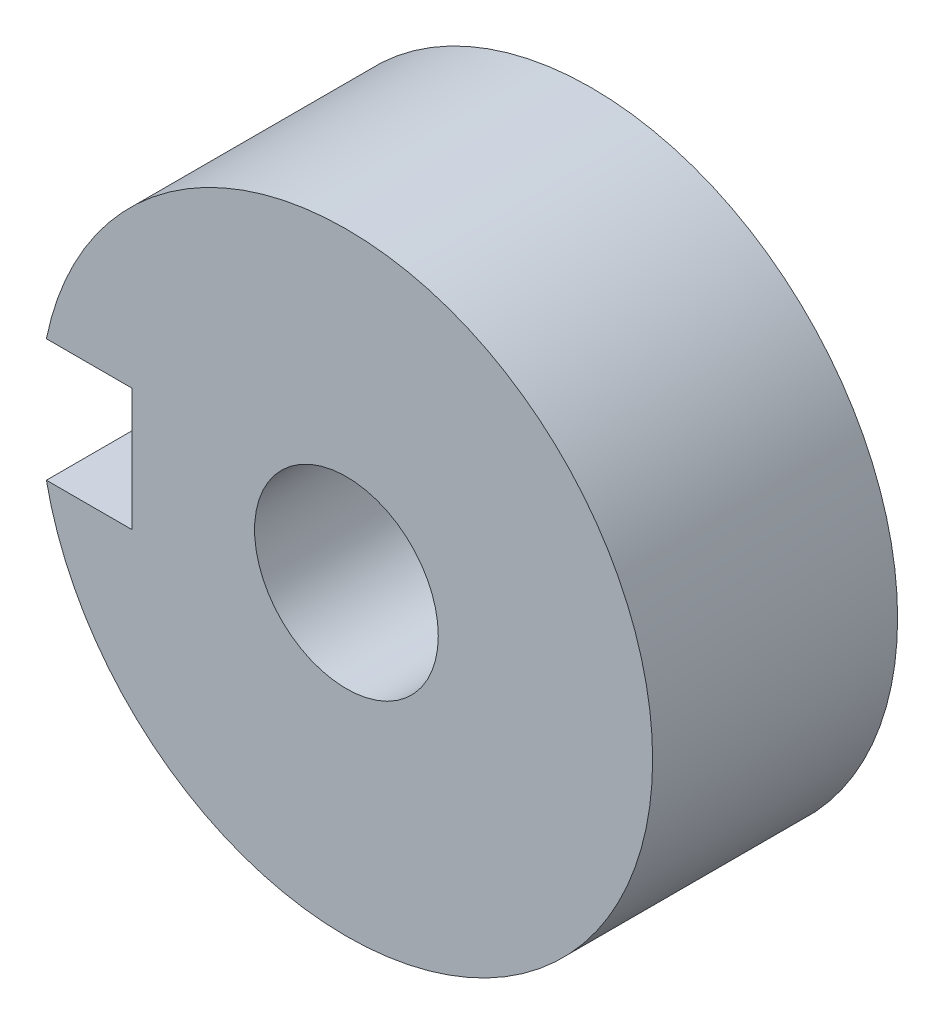
ISO-10303-21;
HEADER;
FILE_DESCRIPTION(('STEP AP214'),'2;1');
FILE_NAME('part.step','',(''),(''),'','','');
FILE_SCHEMA(('AUTOMOTIVE_DESIGN { 1 0 10303 214 1 1 1 1 }'));
ENDSEC;
DATA;
#1=APPLICATION_CONTEXT('core data for automotive mechanical design processes');
#2=APPLICATION_PROTOCOL_DEFINITION('international standard','automotive_design',2000,#1);
#3=PRODUCT_CONTEXT('',#1,'mechanical');
#4=PRODUCT('Part','Part','',(#3));
#5=PRODUCT_RELATED_PRODUCT_CATEGORY('part','',(#4));
#6=PRODUCT_DEFINITION_FORMATION('','',#4);
#7=PRODUCT_DEFINITION_CONTEXT('part definition',#1,'design');
#8=PRODUCT_DEFINITION('design','',#6,#7);
#9=PRODUCT_DEFINITION_SHAPE('','',#8);
#10=(LENGTH_UNIT() NAMED_UNIT(*) SI_UNIT(.MILLI.,.METRE.));
#11=(NAMED_UNIT(*) PLANE_ANGLE_UNIT() SI_UNIT($,.RADIAN.));
#12=(NAMED_UNIT(*) SI_UNIT($,.STERADIAN.) SOLID_ANGLE_UNIT());
#13=UNCERTAINTY_MEASURE_WITH_UNIT(LENGTH_MEASURE(1.E-05),#10,'distance_accuracy_value','');
#14=(GEOMETRIC_REPRESENTATION_CONTEXT(3) GLOBAL_UNCERTAINTY_ASSIGNED_CONTEXT((#13)) GLOBAL_UNIT_ASSIGNED_CONTEXT((#10,
#11,#12)) REPRESENTATION_CONTEXT('',''));
#15=CARTESIAN_POINT('',(0.,0.,0.));
#16=DIRECTION('',(0.,0.,1.));
#17=DIRECTION('',(1.,0.,0.));
#18=AXIS2_PLACEMENT_3D('',#15,#16,#17);
#19=CARTESIAN_POINT('',(0.,0.,4.));
#20=DIRECTION('',(0.,0.,1.));
#21=DIRECTION('',(1.,0.,0.));
#22=AXIS2_PLACEMENT_3D('',#19,#20,#21);
#23=PLANE('',#22);
#24=DIRECTION('',(1.,0.,0.));
#25=VECTOR('',#24,1.);
#26=CARTESIAN_POINT('',(-6.5,-1.,4.));
#27=LINE('',#26,#25);
#28=CARTESIAN_POINT('',(-4.89897948556636,-1.,4.));
#29=VERTEX_POINT('',#28);
#30=CARTESIAN_POINT('',(-3.5,-1.,4.));
#31=VERTEX_POINT('',#30);
#32=EDGE_CURVE('E80',#29,#31,#27,.T.);
#33=ORIENTED_EDGE('',*,*,#32,.F.);
#34=CARTESIAN_POINT('',(0.,0.,4.));
#35=DIRECTION('',(0.,0.,1.));
#36=DIRECTION('',(1.,0.,0.));
#37=AXIS2_PLACEMENT_3D('',#34,#35,#36);
#38=CIRCLE('',#37,5.);
#39=CARTESIAN_POINT('',(-4.89897948556636,1.,4.));
#40=VERTEX_POINT('',#39);
#41=EDGE_CURVE('E92',#29,#40,#38,.T.);
#42=ORIENTED_EDGE('',*,*,#41,.T.);
#43=DIRECTION('',(-1.,0.,0.));
#44=VECTOR('',#43,1.);
#45=CARTESIAN_POINT('',(-6.5,1.,4.));
#46=LINE('',#45,#44);
#47=CARTESIAN_POINT('',(-3.5,1.,4.));
#48=VERTEX_POINT('',#47);
#49=EDGE_CURVE('E48',#48,#40,#46,.T.);
#50=ORIENTED_EDGE('',*,*,#49,.F.);
#51=DIRECTION('',(0.,1.,0.));
#52=VECTOR('',#51,1.);
#53=CARTESIAN_POINT('',(-3.5,1.,4.));
#54=LINE('',#53,#52);
#55=EDGE_CURVE('E83',#31,#48,#54,.T.);
#56=ORIENTED_EDGE('',*,*,#55,.F.);
#57=EDGE_LOOP('',(#33,#42,#50,#56));
#58=FACE_BOUND('',#57,.T.);
#59=CARTESIAN_POINT('',(0.,0.,4.));
#60=DIRECTION('',(0.,0.,1.));
#61=DIRECTION('',(1.,0.,0.));
#62=AXIS2_PLACEMENT_3D('',#59,#60,#61);
#63=CIRCLE('',#62,1.5);
#64=CARTESIAN_POINT('',(1.5,0.,4.));
#65=VERTEX_POINT('',#64);
#66=EDGE_CURVE('E100',#65,#65,#63,.T.);
#67=ORIENTED_EDGE('',*,*,#66,.F.);
#68=EDGE_LOOP('',(#67));
#69=FACE_BOUND('',#68,.T.);
#70=ADVANCED_FACE('F33',(#58,#69),#23,.T.);
#71=CARTESIAN_POINT('',(0.,0.,0.));
#72=DIRECTION('',(0.,0.,1.));
#73=DIRECTION('',(1.,0.,0.));
#74=AXIS2_PLACEMENT_3D('',#71,#72,#73);
#75=PLANE('',#74);
#76=CARTESIAN_POINT('',(0.,0.,0.));
#77=DIRECTION('',(0.,0.,1.));
#78=DIRECTION('',(1.,0.,0.));
#79=AXIS2_PLACEMENT_3D('',#76,#77,#78);
#80=CIRCLE('',#79,5.);
#81=CARTESIAN_POINT('',(-4.89897948556636,-1.,0.));
#82=VERTEX_POINT('',#81);
#83=CARTESIAN_POINT('',(-4.89897948556636,1.,0.));
#84=VERTEX_POINT('',#83);
#85=EDGE_CURVE('E103',#82,#84,#80,.T.);
#86=ORIENTED_EDGE('',*,*,#85,.F.);
#87=DIRECTION('',(1.,0.,0.));
#88=VECTOR('',#87,1.);
#89=CARTESIAN_POINT('',(0.,-1.,0.));
#90=LINE('',#89,#88);
#91=CARTESIAN_POINT('',(-3.5,-1.,0.));
#92=VERTEX_POINT('',#91);
#93=EDGE_CURVE('E56',#82,#92,#90,.T.);
#94=ORIENTED_EDGE('',*,*,#93,.T.);
#95=DIRECTION('',(0.,1.,0.));
#96=VECTOR('',#95,1.);
#97=CARTESIAN_POINT('',(-3.5,0.,0.));
#98=LINE('',#97,#96);
#99=CARTESIAN_POINT('',(-3.5,1.,0.));
#100=VERTEX_POINT('',#99);
#101=EDGE_CURVE('E11',#92,#100,#98,.T.);
#102=ORIENTED_EDGE('',*,*,#101,.T.);
#103=DIRECTION('',(-1.,0.,0.));
#104=VECTOR('',#103,1.);
#105=CARTESIAN_POINT('',(0.,1.,0.));
#106=LINE('',#105,#104);
#107=EDGE_CURVE('E77',#100,#84,#106,.T.);
#108=ORIENTED_EDGE('',*,*,#107,.T.);
#109=EDGE_LOOP('',(#86,#94,#102,#108));
#110=FACE_BOUND('',#109,.T.);
#111=CARTESIAN_POINT('',(0.,0.,0.));
#112=DIRECTION('',(0.,0.,1.));
#113=DIRECTION('',(1.,0.,0.));
#114=AXIS2_PLACEMENT_3D('',#111,#112,#113);
#115=CIRCLE('',#114,1.5);
#116=CARTESIAN_POINT('',(1.5,0.,0.));
#117=VERTEX_POINT('',#116);
#118=EDGE_CURVE('E99',#117,#117,#115,.T.);
#119=ORIENTED_EDGE('',*,*,#118,.T.);
#120=EDGE_LOOP('',(#119));
#121=FACE_BOUND('',#120,.T.);
#122=ADVANCED_FACE('F113',(#110,#121),#75,.F.);
#123=CARTESIAN_POINT('',(0.,0.,4.));
#124=DIRECTION('',(0.,0.,-1.));
#125=DIRECTION('',(-1.,0.,0.));
#126=AXIS2_PLACEMENT_3D('',#123,#124,#125);
#127=CYLINDRICAL_SURFACE('',#126,5.);
#128=ORIENTED_EDGE('',*,*,#41,.F.);
#129=DIRECTION('',(0.,0.,-1.));
#130=VECTOR('',#129,1.);
#131=CARTESIAN_POINT('',(-4.89897948556636,-1.,4.));
#132=LINE('',#131,#130);
#133=EDGE_CURVE('E41',#29,#82,#132,.T.);
#134=ORIENTED_EDGE('',*,*,#133,.T.);
#135=ORIENTED_EDGE('',*,*,#85,.T.);
#136=DIRECTION('',(0.,0.,-1.));
#137=VECTOR('',#136,1.);
#138=CARTESIAN_POINT('',(-4.89897948556636,1.,4.));
#139=LINE('',#138,#137);
#140=EDGE_CURVE('E107',#84,#40,#139,.F.);
#141=ORIENTED_EDGE('',*,*,#140,.T.);
#142=EDGE_LOOP('',(#128,#134,#135,#141));
#143=FACE_BOUND('',#142,.T.);
#144=ADVANCED_FACE('F35',(#143),#127,.T.);
#145=CARTESIAN_POINT('',(0.,0.,4.));
#146=DIRECTION('',(0.,0.,-1.));
#147=DIRECTION('',(-1.,0.,0.));
#148=AXIS2_PLACEMENT_3D('',#145,#146,#147);
#149=CYLINDRICAL_SURFACE('',#148,1.5);
#150=ORIENTED_EDGE('',*,*,#66,.T.);
#151=EDGE_LOOP('',(#150));
#152=FACE_BOUND('',#151,.T.);
#153=ORIENTED_EDGE('',*,*,#118,.F.);
#154=EDGE_LOOP('',(#153));
#155=FACE_BOUND('',#154,.T.);
#156=ADVANCED_FACE('F123',(#152,#155),#149,.F.);
#157=CARTESIAN_POINT('',(-3.5,1.,-6.));
#158=DIRECTION('',(1.,0.,0.));
#159=DIRECTION('',(0.,0.,-1.));
#160=AXIS2_PLACEMENT_3D('',#157,#158,#159);
#161=PLANE('',#160);
#162=DIRECTION('',(0.,0.,1.));
#163=VECTOR('',#162,1.);
#164=CARTESIAN_POINT('',(-3.5,-1.,-6.));
#165=LINE('',#164,#163);
#166=EDGE_CURVE('E79',#92,#31,#165,.T.);
#167=ORIENTED_EDGE('',*,*,#166,.T.);
#168=ORIENTED_EDGE('',*,*,#55,.T.);
#169=DIRECTION('',(0.,0.,1.));
#170=VECTOR('',#169,1.);
#171=CARTESIAN_POINT('',(-3.5,1.,-6.));
#172=LINE('',#171,#170);
#173=EDGE_CURVE('E73',#100,#48,#172,.T.);
#174=ORIENTED_EDGE('',*,*,#173,.F.);
#175=ORIENTED_EDGE('',*,*,#101,.F.);
#176=EDGE_LOOP('',(#167,#168,#174,#175));
#177=FACE_BOUND('',#176,.T.);
#178=ADVANCED_FACE('F84',(#177),#161,.F.);
#179=CARTESIAN_POINT('',(-6.5,-1.,-6.));
#180=DIRECTION('',(0.,-1.,0.));
#181=DIRECTION('',(0.,0.,-1.));
#182=AXIS2_PLACEMENT_3D('',#179,#180,#181);
#183=PLANE('',#182);
#184=ORIENTED_EDGE('',*,*,#133,.F.);
#185=ORIENTED_EDGE('',*,*,#32,.T.);
#186=ORIENTED_EDGE('',*,*,#166,.F.);
#187=ORIENTED_EDGE('',*,*,#93,.F.);
#188=EDGE_LOOP('',(#184,#185,#186,#187));
#189=FACE_BOUND('',#188,.T.);
#190=ADVANCED_FACE('F115',(#189),#183,.F.);
#191=CARTESIAN_POINT('',(-6.5,1.,-6.));
#192=DIRECTION('',(0.,1.,0.));
#193=DIRECTION('',(0.,0.,1.));
#194=AXIS2_PLACEMENT_3D('',#191,#192,#193);
#195=PLANE('',#194);
#196=ORIENTED_EDGE('',*,*,#173,.T.);
#197=ORIENTED_EDGE('',*,*,#49,.T.);
#198=ORIENTED_EDGE('',*,*,#140,.F.);
#199=ORIENTED_EDGE('',*,*,#107,.F.);
#200=EDGE_LOOP('',(#196,#197,#198,#199));
#201=FACE_BOUND('',#200,.T.);
#202=ADVANCED_FACE('F75',(#201),#195,.F.);
#203=CLOSED_SHELL('',(#70,#122,#144,#156,#178,#190,#202));
#204=MANIFOLD_SOLID_BREP('B2',#203);
#205=ADVANCED_BREP_SHAPE_REPRESENTATION('',(#18,#204),#14);
#206=SHAPE_DEFINITION_REPRESENTATION(#9,#205);
ENDSEC;
END-ISO-10303-21;
